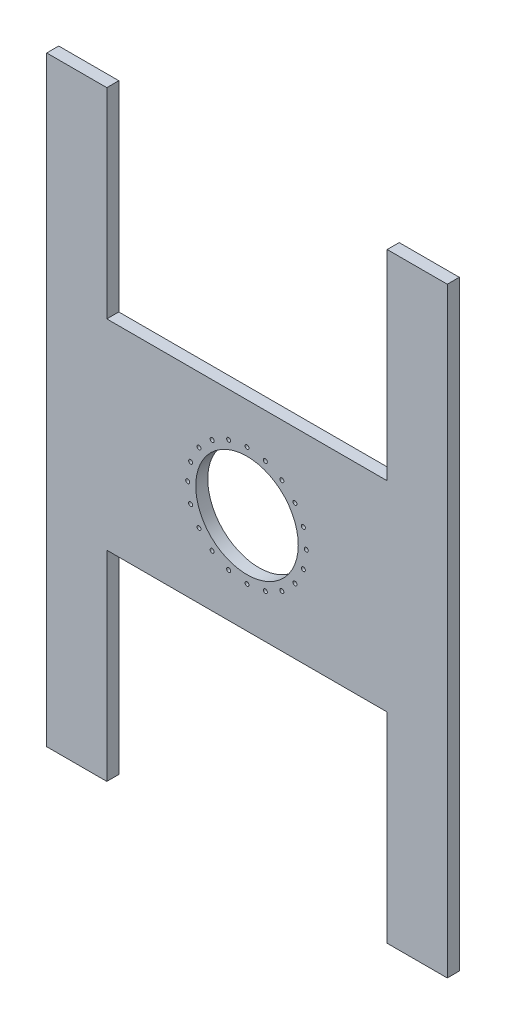
ISO-10303-21;
HEADER;
FILE_DESCRIPTION(('STEP AP214'),'2;1');
FILE_NAME('part.step','',(''),(''),'','','');
FILE_SCHEMA(('AUTOMOTIVE_DESIGN { 1 0 10303 214 1 1 1 1 }'));
ENDSEC;
DATA;
#1=APPLICATION_CONTEXT('core data for automotive mechanical design processes');
#2=APPLICATION_PROTOCOL_DEFINITION('international standard','automotive_design',2000,#1);
#3=PRODUCT_CONTEXT('',#1,'mechanical');
#4=PRODUCT('Part','Part','',(#3));
#5=PRODUCT_RELATED_PRODUCT_CATEGORY('part','',(#4));
#6=PRODUCT_DEFINITION_FORMATION('','',#4);
#7=PRODUCT_DEFINITION_CONTEXT('part definition',#1,'design');
#8=PRODUCT_DEFINITION('design','',#6,#7);
#9=PRODUCT_DEFINITION_SHAPE('','',#8);
#10=(LENGTH_UNIT() NAMED_UNIT(*) SI_UNIT(.MILLI.,.METRE.));
#11=(NAMED_UNIT(*) PLANE_ANGLE_UNIT() SI_UNIT($,.RADIAN.));
#12=(NAMED_UNIT(*) SI_UNIT($,.STERADIAN.) SOLID_ANGLE_UNIT());
#13=UNCERTAINTY_MEASURE_WITH_UNIT(LENGTH_MEASURE(1.E-05),#10,'distance_accuracy_value','');
#14=(GEOMETRIC_REPRESENTATION_CONTEXT(3) GLOBAL_UNCERTAINTY_ASSIGNED_CONTEXT((#13)) GLOBAL_UNIT_ASSIGNED_CONTEXT((#10,
#11,#12)) REPRESENTATION_CONTEXT('',''));
#15=CARTESIAN_POINT('',(0.,0.,0.));
#16=DIRECTION('',(0.,0.,1.));
#17=DIRECTION('',(1.,0.,0.));
#18=AXIS2_PLACEMENT_3D('',#15,#16,#17);
#19=CARTESIAN_POINT('',(-1000.,-1000.,60.));
#20=DIRECTION('',(1.,0.,0.));
#21=DIRECTION('',(0.,0.,-1.));
#22=AXIS2_PLACEMENT_3D('',#19,#20,#21);
#23=PLANE('',#22);
#24=DIRECTION('',(0.,-1.,0.));
#25=VECTOR('',#24,1.);
#26=CARTESIAN_POINT('',(-1000.,-1000.,0.));
#27=LINE('',#26,#25);
#28=CARTESIAN_POINT('',(-1000.,2000.,0.));
#29=VERTEX_POINT('',#28);
#30=CARTESIAN_POINT('',(-1000.,-1000.,0.));
#31=VERTEX_POINT('',#30);
#32=EDGE_CURVE('E153',#29,#31,#27,.T.);
#33=ORIENTED_EDGE('',*,*,#32,.T.);
#34=DIRECTION('',(0.,0.,-1.));
#35=VECTOR('',#34,1.);
#36=CARTESIAN_POINT('',(-1000.,-1000.,60.));
#37=LINE('',#36,#35);
#38=CARTESIAN_POINT('',(-1000.,-1000.,60.));
#39=VERTEX_POINT('',#38);
#40=EDGE_CURVE('E11',#39,#31,#37,.T.);
#41=ORIENTED_EDGE('',*,*,#40,.F.);
#42=DIRECTION('',(0.,-1.,0.));
#43=VECTOR('',#42,1.);
#44=CARTESIAN_POINT('',(-1000.,-1000.,60.));
#45=LINE('',#44,#43);
#46=CARTESIAN_POINT('',(-1000.,2000.,60.));
#47=VERTEX_POINT('',#46);
#48=EDGE_CURVE('E176',#47,#39,#45,.T.);
#49=ORIENTED_EDGE('',*,*,#48,.F.);
#50=DIRECTION('',(0.,0.,-1.));
#51=VECTOR('',#50,1.);
#52=CARTESIAN_POINT('',(-1000.,2000.,60.));
#53=LINE('',#52,#51);
#54=EDGE_CURVE('E149',#47,#29,#53,.T.);
#55=ORIENTED_EDGE('',*,*,#54,.T.);
#56=EDGE_LOOP('',(#33,#41,#49,#55));
#57=FACE_BOUND('',#56,.T.);
#58=ADVANCED_FACE('F33',(#57),#23,.F.);
#59=CARTESIAN_POINT('',(-700.,-1000.,60.));
#60=DIRECTION('',(0.,1.,0.));
#61=DIRECTION('',(0.,0.,1.));
#62=AXIS2_PLACEMENT_3D('',#59,#60,#61);
#63=PLANE('',#62);
#64=DIRECTION('',(1.,0.,0.));
#65=VECTOR('',#64,1.);
#66=CARTESIAN_POINT('',(-700.,-1000.,0.));
#67=LINE('',#66,#65);
#68=CARTESIAN_POINT('',(-700.,-1000.,0.));
#69=VERTEX_POINT('',#68);
#70=EDGE_CURVE('E156',#31,#69,#67,.T.);
#71=ORIENTED_EDGE('',*,*,#70,.T.);
#72=DIRECTION('',(0.,0.,-1.));
#73=VECTOR('',#72,1.);
#74=CARTESIAN_POINT('',(-700.,-1000.,60.));
#75=LINE('',#74,#73);
#76=CARTESIAN_POINT('',(-700.,-1000.,60.));
#77=VERTEX_POINT('',#76);
#78=EDGE_CURVE('E41',#77,#69,#75,.T.);
#79=ORIENTED_EDGE('',*,*,#78,.F.);
#80=DIRECTION('',(1.,0.,0.));
#81=VECTOR('',#80,1.);
#82=CARTESIAN_POINT('',(-700.,-1000.,60.));
#83=LINE('',#82,#81);
#84=EDGE_CURVE('E104',#39,#77,#83,.T.);
#85=ORIENTED_EDGE('',*,*,#84,.F.);
#86=ORIENTED_EDGE('',*,*,#40,.T.);
#87=EDGE_LOOP('',(#71,#79,#85,#86));
#88=FACE_BOUND('',#87,.T.);
#89=ADVANCED_FACE('F255',(#88),#63,.F.);
#90=CARTESIAN_POINT('',(-700.,-1.11022302462516E-13,60.));
#91=DIRECTION('',(-1.,0.,0.));
#92=DIRECTION('',(0.,0.,1.));
#93=AXIS2_PLACEMENT_3D('',#90,#91,#92);
#94=PLANE('',#93);
#95=DIRECTION('',(0.,1.,0.));
#96=VECTOR('',#95,1.);
#97=CARTESIAN_POINT('',(-700.,-1.11022302462516E-13,0.));
#98=LINE('',#97,#96);
#99=CARTESIAN_POINT('',(-700.,-1.11022302462516E-13,0.));
#100=VERTEX_POINT('',#99);
#101=EDGE_CURVE('E159',#69,#100,#98,.T.);
#102=ORIENTED_EDGE('',*,*,#101,.T.);
#103=DIRECTION('',(0.,0.,-1.));
#104=VECTOR('',#103,1.);
#105=CARTESIAN_POINT('',(-700.,-1.11022302462516E-13,60.));
#106=LINE('',#105,#104);
#107=CARTESIAN_POINT('',(-700.,-1.11022302462516E-13,60.));
#108=VERTEX_POINT('',#107);
#109=EDGE_CURVE('E195',#108,#100,#106,.T.);
#110=ORIENTED_EDGE('',*,*,#109,.F.);
#111=DIRECTION('',(0.,1.,0.));
#112=VECTOR('',#111,1.);
#113=CARTESIAN_POINT('',(-700.,-1.11022302462516E-13,60.));
#114=LINE('',#113,#112);
#115=EDGE_CURVE('E203',#77,#108,#114,.T.);
#116=ORIENTED_EDGE('',*,*,#115,.F.);
#117=ORIENTED_EDGE('',*,*,#78,.T.);
#118=EDGE_LOOP('',(#102,#110,#116,#117));
#119=FACE_BOUND('',#118,.T.);
#120=ADVANCED_FACE('F201',(#119),#94,.F.);
#121=CARTESIAN_POINT('',(700.,0.,60.));
#122=DIRECTION('',(0.,1.,0.));
#123=DIRECTION('',(-1.,0.,0.));
#124=AXIS2_PLACEMENT_3D('',#121,#122,#123);
#125=PLANE('',#124);
#126=DIRECTION('',(1.,0.,0.));
#127=VECTOR('',#126,1.);
#128=CARTESIAN_POINT('',(700.,0.,0.));
#129=LINE('',#128,#127);
#130=CARTESIAN_POINT('',(700.,0.,0.));
#131=VERTEX_POINT('',#130);
#132=EDGE_CURVE('E161',#100,#131,#129,.T.);
#133=ORIENTED_EDGE('',*,*,#132,.T.);
#134=DIRECTION('',(0.,0.,-1.));
#135=VECTOR('',#134,1.);
#136=CARTESIAN_POINT('',(700.,0.,60.));
#137=LINE('',#136,#135);
#138=CARTESIAN_POINT('',(700.,0.,60.));
#139=VERTEX_POINT('',#138);
#140=EDGE_CURVE('E192',#139,#131,#137,.T.);
#141=ORIENTED_EDGE('',*,*,#140,.F.);
#142=DIRECTION('',(1.,0.,0.));
#143=VECTOR('',#142,1.);
#144=CARTESIAN_POINT('',(700.,0.,60.));
#145=LINE('',#144,#143);
#146=EDGE_CURVE('E221',#108,#139,#145,.T.);
#147=ORIENTED_EDGE('',*,*,#146,.F.);
#148=ORIENTED_EDGE('',*,*,#109,.T.);
#149=EDGE_LOOP('',(#133,#141,#147,#148));
#150=FACE_BOUND('',#149,.T.);
#151=ADVANCED_FACE('F212',(#150),#125,.F.);
#152=CARTESIAN_POINT('',(700.,-1000.,60.));
#153=DIRECTION('',(1.,0.,0.));
#154=DIRECTION('',(0.,1.,0.));
#155=AXIS2_PLACEMENT_3D('',#152,#153,#154);
#156=PLANE('',#155);
#157=DIRECTION('',(0.,-1.,0.));
#158=VECTOR('',#157,1.);
#159=CARTESIAN_POINT('',(700.,-1000.,0.));
#160=LINE('',#159,#158);
#161=CARTESIAN_POINT('',(700.,-1000.,0.));
#162=VERTEX_POINT('',#161);
#163=EDGE_CURVE('E163',#131,#162,#160,.T.);
#164=ORIENTED_EDGE('',*,*,#163,.T.);
#165=DIRECTION('',(0.,0.,-1.));
#166=VECTOR('',#165,1.);
#167=CARTESIAN_POINT('',(700.,-1000.,60.));
#168=LINE('',#167,#166);
#169=CARTESIAN_POINT('',(700.,-1000.,60.));
#170=VERTEX_POINT('',#169);
#171=EDGE_CURVE('E189',#170,#162,#168,.T.);
#172=ORIENTED_EDGE('',*,*,#171,.F.);
#173=DIRECTION('',(0.,-1.,0.));
#174=VECTOR('',#173,1.);
#175=CARTESIAN_POINT('',(700.,-1000.,60.));
#176=LINE('',#175,#174);
#177=EDGE_CURVE('E218',#139,#170,#176,.T.);
#178=ORIENTED_EDGE('',*,*,#177,.F.);
#179=ORIENTED_EDGE('',*,*,#140,.T.);
#180=EDGE_LOOP('',(#164,#172,#178,#179));
#181=FACE_BOUND('',#180,.T.);
#182=ADVANCED_FACE('F216',(#181),#156,.F.);
#183=CARTESIAN_POINT('',(1000.,-1000.,60.));
#184=DIRECTION('',(0.,1.,0.));
#185=DIRECTION('',(0.,0.,1.));
#186=AXIS2_PLACEMENT_3D('',#183,#184,#185);
#187=PLANE('',#186);
#188=DIRECTION('',(1.,0.,0.));
#189=VECTOR('',#188,1.);
#190=CARTESIAN_POINT('',(1000.,-1000.,0.));
#191=LINE('',#190,#189);
#192=CARTESIAN_POINT('',(1000.,-1000.,0.));
#193=VERTEX_POINT('',#192);
#194=EDGE_CURVE('E165',#162,#193,#191,.T.);
#195=ORIENTED_EDGE('',*,*,#194,.T.);
#196=DIRECTION('',(0.,0.,-1.));
#197=VECTOR('',#196,1.);
#198=CARTESIAN_POINT('',(1000.,-1000.,60.));
#199=LINE('',#198,#197);
#200=CARTESIAN_POINT('',(1000.,-1000.,60.));
#201=VERTEX_POINT('',#200);
#202=EDGE_CURVE('E186',#201,#193,#199,.T.);
#203=ORIENTED_EDGE('',*,*,#202,.F.);
#204=DIRECTION('',(1.,0.,0.));
#205=VECTOR('',#204,1.);
#206=CARTESIAN_POINT('',(1000.,-1000.,60.));
#207=LINE('',#206,#205);
#208=EDGE_CURVE('E220',#170,#201,#207,.T.);
#209=ORIENTED_EDGE('',*,*,#208,.F.);
#210=ORIENTED_EDGE('',*,*,#171,.T.);
#211=EDGE_LOOP('',(#195,#203,#209,#210));
#212=FACE_BOUND('',#211,.T.);
#213=ADVANCED_FACE('F268',(#212),#187,.F.);
#214=CARTESIAN_POINT('',(1000.,2000.,60.));
#215=DIRECTION('',(-1.,0.,0.));
#216=DIRECTION('',(0.,-1.,0.));
#217=AXIS2_PLACEMENT_3D('',#214,#215,#216);
#218=PLANE('',#217);
#219=DIRECTION('',(0.,1.,0.));
#220=VECTOR('',#219,1.);
#221=CARTESIAN_POINT('',(1000.,2000.,0.));
#222=LINE('',#221,#220);
#223=CARTESIAN_POINT('',(1000.,2000.,0.));
#224=VERTEX_POINT('',#223);
#225=EDGE_CURVE('E167',#193,#224,#222,.T.);
#226=ORIENTED_EDGE('',*,*,#225,.T.);
#227=DIRECTION('',(0.,0.,-1.));
#228=VECTOR('',#227,1.);
#229=CARTESIAN_POINT('',(1000.,2000.,60.));
#230=LINE('',#229,#228);
#231=CARTESIAN_POINT('',(1000.,2000.,60.));
#232=VERTEX_POINT('',#231);
#233=EDGE_CURVE('E183',#232,#224,#230,.T.);
#234=ORIENTED_EDGE('',*,*,#233,.F.);
#235=DIRECTION('',(0.,1.,0.));
#236=VECTOR('',#235,1.);
#237=CARTESIAN_POINT('',(1000.,2000.,60.));
#238=LINE('',#237,#236);
#239=EDGE_CURVE('E223',#201,#232,#238,.T.);
#240=ORIENTED_EDGE('',*,*,#239,.F.);
#241=ORIENTED_EDGE('',*,*,#202,.T.);
#242=EDGE_LOOP('',(#226,#234,#240,#241));
#243=FACE_BOUND('',#242,.T.);
#244=ADVANCED_FACE('F271',(#243),#218,.F.);
#245=CARTESIAN_POINT('',(700.,2000.,60.));
#246=DIRECTION('',(0.,-1.,0.));
#247=DIRECTION('',(1.,0.,0.));
#248=AXIS2_PLACEMENT_3D('',#245,#246,#247);
#249=PLANE('',#248);
#250=DIRECTION('',(-1.,0.,0.));
#251=VECTOR('',#250,1.);
#252=CARTESIAN_POINT('',(700.,2000.,0.));
#253=LINE('',#252,#251);
#254=CARTESIAN_POINT('',(700.,2000.,0.));
#255=VERTEX_POINT('',#254);
#256=EDGE_CURVE('E169',#224,#255,#253,.T.);
#257=ORIENTED_EDGE('',*,*,#256,.T.);
#258=DIRECTION('',(0.,0.,-1.));
#259=VECTOR('',#258,1.);
#260=CARTESIAN_POINT('',(700.,2000.,60.));
#261=LINE('',#260,#259);
#262=CARTESIAN_POINT('',(700.,2000.,60.));
#263=VERTEX_POINT('',#262);
#264=EDGE_CURVE('E180',#263,#255,#261,.T.);
#265=ORIENTED_EDGE('',*,*,#264,.F.);
#266=DIRECTION('',(-1.,0.,0.));
#267=VECTOR('',#266,1.);
#268=CARTESIAN_POINT('',(700.,2000.,60.));
#269=LINE('',#268,#267);
#270=EDGE_CURVE('E229',#232,#263,#269,.T.);
#271=ORIENTED_EDGE('',*,*,#270,.F.);
#272=ORIENTED_EDGE('',*,*,#233,.T.);
#273=EDGE_LOOP('',(#257,#265,#271,#272));
#274=FACE_BOUND('',#273,.T.);
#275=ADVANCED_FACE('F235',(#274),#249,.F.);
#276=CARTESIAN_POINT('',(700.,1000.,60.));
#277=DIRECTION('',(1.,0.,0.));
#278=DIRECTION('',(0.,0.,-1.));
#279=AXIS2_PLACEMENT_3D('',#276,#277,#278);
#280=PLANE('',#279);
#281=DIRECTION('',(0.,-1.,0.));
#282=VECTOR('',#281,1.);
#283=CARTESIAN_POINT('',(700.,1000.,0.));
#284=LINE('',#283,#282);
#285=CARTESIAN_POINT('',(700.,1000.,0.));
#286=VERTEX_POINT('',#285);
#287=EDGE_CURVE('E171',#255,#286,#284,.T.);
#288=ORIENTED_EDGE('',*,*,#287,.T.);
#289=DIRECTION('',(0.,0.,-1.));
#290=VECTOR('',#289,1.);
#291=CARTESIAN_POINT('',(700.,1000.,60.));
#292=LINE('',#291,#290);
#293=CARTESIAN_POINT('',(700.,1000.,60.));
#294=VERTEX_POINT('',#293);
#295=EDGE_CURVE('E144',#294,#286,#292,.T.);
#296=ORIENTED_EDGE('',*,*,#295,.F.);
#297=DIRECTION('',(0.,-1.,0.));
#298=VECTOR('',#297,1.);
#299=CARTESIAN_POINT('',(700.,1000.,60.));
#300=LINE('',#299,#298);
#301=EDGE_CURVE('E135',#263,#294,#300,.T.);
#302=ORIENTED_EDGE('',*,*,#301,.F.);
#303=ORIENTED_EDGE('',*,*,#264,.T.);
#304=EDGE_LOOP('',(#288,#296,#302,#303));
#305=FACE_BOUND('',#304,.T.);
#306=ADVANCED_FACE('F239',(#305),#280,.F.);
#307=CARTESIAN_POINT('',(-700.,1000.,60.));
#308=DIRECTION('',(0.,-1.,0.));
#309=DIRECTION('',(1.,0.,0.));
#310=AXIS2_PLACEMENT_3D('',#307,#308,#309);
#311=PLANE('',#310);
#312=DIRECTION('',(-1.,0.,0.));
#313=VECTOR('',#312,1.);
#314=CARTESIAN_POINT('',(-700.,1000.,0.));
#315=LINE('',#314,#313);
#316=CARTESIAN_POINT('',(-700.,1000.,0.));
#317=VERTEX_POINT('',#316);
#318=EDGE_CURVE('E143',#286,#317,#315,.T.);
#319=ORIENTED_EDGE('',*,*,#318,.T.);
#320=DIRECTION('',(0.,0.,-1.));
#321=VECTOR('',#320,1.);
#322=CARTESIAN_POINT('',(-700.,1000.,60.));
#323=LINE('',#322,#321);
#324=CARTESIAN_POINT('',(-700.,1000.,60.));
#325=VERTEX_POINT('',#324);
#326=EDGE_CURVE('E140',#325,#317,#323,.T.);
#327=ORIENTED_EDGE('',*,*,#326,.F.);
#328=DIRECTION('',(-1.,0.,0.));
#329=VECTOR('',#328,1.);
#330=CARTESIAN_POINT('',(-700.,1000.,60.));
#331=LINE('',#330,#329);
#332=EDGE_CURVE('E129',#294,#325,#331,.T.);
#333=ORIENTED_EDGE('',*,*,#332,.F.);
#334=ORIENTED_EDGE('',*,*,#295,.T.);
#335=EDGE_LOOP('',(#319,#327,#333,#334));
#336=FACE_BOUND('',#335,.T.);
#337=ADVANCED_FACE('F141',(#336),#311,.F.);
#338=CARTESIAN_POINT('',(-700.,2000.,60.));
#339=DIRECTION('',(-1.,0.,0.));
#340=DIRECTION('',(0.,-1.,0.));
#341=AXIS2_PLACEMENT_3D('',#338,#339,#340);
#342=PLANE('',#341);
#343=DIRECTION('',(0.,1.,0.));
#344=VECTOR('',#343,1.);
#345=CARTESIAN_POINT('',(-700.,2000.,0.));
#346=LINE('',#345,#344);
#347=CARTESIAN_POINT('',(-700.,2000.,0.));
#348=VERTEX_POINT('',#347);
#349=EDGE_CURVE('E90',#317,#348,#346,.T.);
#350=ORIENTED_EDGE('',*,*,#349,.T.);
#351=DIRECTION('',(0.,0.,-1.));
#352=VECTOR('',#351,1.);
#353=CARTESIAN_POINT('',(-700.,2000.,60.));
#354=LINE('',#353,#352);
#355=CARTESIAN_POINT('',(-700.,2000.,60.));
#356=VERTEX_POINT('',#355);
#357=EDGE_CURVE('E145',#356,#348,#354,.T.);
#358=ORIENTED_EDGE('',*,*,#357,.F.);
#359=DIRECTION('',(0.,1.,0.));
#360=VECTOR('',#359,1.);
#361=CARTESIAN_POINT('',(-700.,2000.,60.));
#362=LINE('',#361,#360);
#363=EDGE_CURVE('E133',#325,#356,#362,.T.);
#364=ORIENTED_EDGE('',*,*,#363,.F.);
#365=ORIENTED_EDGE('',*,*,#326,.T.);
#366=EDGE_LOOP('',(#350,#358,#364,#365));
#367=FACE_BOUND('',#366,.T.);
#368=ADVANCED_FACE('F147',(#367),#342,.F.);
#369=CARTESIAN_POINT('',(-1000.,2000.,60.));
#370=DIRECTION('',(0.,-1.,0.));
#371=DIRECTION('',(0.,0.,-1.));
#372=AXIS2_PLACEMENT_3D('',#369,#370,#371);
#373=PLANE('',#372);
#374=DIRECTION('',(-1.,0.,0.));
#375=VECTOR('',#374,1.);
#376=CARTESIAN_POINT('',(-1000.,2000.,0.));
#377=LINE('',#376,#375);
#378=EDGE_CURVE('E96',#348,#29,#377,.T.);
#379=ORIENTED_EDGE('',*,*,#378,.T.);
#380=ORIENTED_EDGE('',*,*,#54,.F.);
#381=DIRECTION('',(-1.,0.,0.));
#382=VECTOR('',#381,1.);
#383=CARTESIAN_POINT('',(-1000.,2000.,60.));
#384=LINE('',#383,#382);
#385=EDGE_CURVE('E49',#356,#47,#384,.T.);
#386=ORIENTED_EDGE('',*,*,#385,.F.);
#387=ORIENTED_EDGE('',*,*,#357,.T.);
#388=EDGE_LOOP('',(#379,#380,#386,#387));
#389=FACE_BOUND('',#388,.T.);
#390=ADVANCED_FACE('F243',(#389),#373,.F.);
#391=CARTESIAN_POINT('',(0.,0.,60.));
#392=DIRECTION('',(0.,0.,-1.));
#393=DIRECTION('',(-1.,0.,0.));
#394=AXIS2_PLACEMENT_3D('',#391,#392,#393);
#395=PLANE('',#394);
#396=CARTESIAN_POINT('',(173.984434678572,739.469030334984,60.));
#397=DIRECTION('',(0.,0.,1.));
#398=DIRECTION('',(0.809016994374947,-0.587785252292474,0.));
#399=AXIS2_PLACEMENT_3D('',#396,#397,#398);
#400=CIRCLE('',#399,10.);
#401=CARTESIAN_POINT('',(182.074604622322,733.59117781206,60.));
#402=VERTEX_POINT('',#401);
#403=EDGE_CURVE('E524',#402,#402,#400,.T.);
#404=ORIENTED_EDGE('',*,*,#403,.F.);
#405=EDGE_LOOP('',(#404));
#406=FACE_BOUND('',#405,.T.);
#407=CARTESIAN_POINT('',(239.469030334985,673.984434678571,60.));
#408=DIRECTION('',(0.,0.,1.));
#409=DIRECTION('',(0.587785252292471,-0.809016994374949,0.));
#410=AXIS2_PLACEMENT_3D('',#407,#408,#409);
#411=CIRCLE('',#410,10.);
#412=CARTESIAN_POINT('',(245.34688285791,665.894264734822,60.));
#413=VERTEX_POINT('',#412);
#414=EDGE_CURVE('E528',#413,#413,#411,.T.);
#415=ORIENTED_EDGE('',*,*,#414,.F.);
#416=EDGE_LOOP('',(#415));
#417=FACE_BOUND('',#416,.T.);
#418=CARTESIAN_POINT('',(281.512728823366,591.469030334984,60.));
#419=DIRECTION('',(0.,0.,1.));
#420=DIRECTION('',(0.309016994374945,-0.951056516295155,0.));
#421=AXIS2_PLACEMENT_3D('',#418,#419,#420);
#422=CIRCLE('',#421,10.);
#423=CARTESIAN_POINT('',(284.602898767115,581.958465172032,60.));
#424=VERTEX_POINT('',#423);
#425=EDGE_CURVE('E539',#424,#424,#422,.T.);
#426=ORIENTED_EDGE('',*,*,#425,.F.);
#427=EDGE_LOOP('',(#426));
#428=FACE_BOUND('',#427,.T.);
#429=CARTESIAN_POINT('',(296.,499.999999999999,60.));
#430=DIRECTION('',(0.,0.,1.));
#431=DIRECTION('',(0.,-1.,0.));
#432=AXIS2_PLACEMENT_3D('',#429,#430,#431);
#433=CIRCLE('',#432,10.);
#434=CARTESIAN_POINT('',(296.,489.999999999999,60.));
#435=VERTEX_POINT('',#434);
#436=EDGE_CURVE('E545',#435,#435,#433,.T.);
#437=ORIENTED_EDGE('',*,*,#436,.F.);
#438=EDGE_LOOP('',(#437));
#439=FACE_BOUND('',#438,.T.);
#440=CARTESIAN_POINT('',(281.512728823365,408.530969665014,60.));
#441=DIRECTION('',(0.,0.,1.));
#442=DIRECTION('',(-0.309016994374952,-0.951056516295152,0.));
#443=AXIS2_PLACEMENT_3D('',#440,#441,#442);
#444=CIRCLE('',#443,10.);
#445=CARTESIAN_POINT('',(278.422558879616,399.020404502063,60.));
#446=VERTEX_POINT('',#445);
#447=EDGE_CURVE('E551',#446,#446,#444,.T.);
#448=ORIENTED_EDGE('',*,*,#447,.F.);
#449=EDGE_LOOP('',(#448));
#450=FACE_BOUND('',#449,.T.);
#451=CARTESIAN_POINT('',(239.469030334984,326.015565321427,60.));
#452=DIRECTION('',(0.,0.,1.));
#453=DIRECTION('',(-0.587785252292477,-0.809016994374945,0.));
#454=AXIS2_PLACEMENT_3D('',#451,#452,#453);
#455=CIRCLE('',#454,10.);
#456=CARTESIAN_POINT('',(233.591177812059,317.925395377677,60.));
#457=VERTEX_POINT('',#456);
#458=EDGE_CURVE('E557',#457,#457,#455,.T.);
#459=ORIENTED_EDGE('',*,*,#458,.F.);
#460=EDGE_LOOP('',(#459));
#461=FACE_BOUND('',#460,.T.);
#462=CARTESIAN_POINT('',(173.984434678571,260.530969665015,60.));
#463=DIRECTION('',(0.,0.,1.));
#464=DIRECTION('',(-0.809016994374951,-0.587785252292469,0.));
#465=AXIS2_PLACEMENT_3D('',#462,#463,#464);
#466=CIRCLE('',#465,10.);
#467=CARTESIAN_POINT('',(165.894264734821,254.65311714209,60.));
#468=VERTEX_POINT('',#467);
#469=EDGE_CURVE('E563',#468,#468,#466,.T.);
#470=ORIENTED_EDGE('',*,*,#469,.F.);
#471=EDGE_LOOP('',(#470));
#472=FACE_BOUND('',#471,.T.);
#473=CARTESIAN_POINT('',(91.4690303349826,218.487271176634,60.));
#474=DIRECTION('',(0.,0.,1.));
#475=DIRECTION('',(-0.951056516295156,-0.309016994374941,0.));
#476=AXIS2_PLACEMENT_3D('',#473,#474,#475);
#477=CIRCLE('',#476,10.);
#478=CARTESIAN_POINT('',(81.958465172031,215.397101232884,60.));
#479=VERTEX_POINT('',#478);
#480=EDGE_CURVE('E569',#479,#479,#477,.T.);
#481=ORIENTED_EDGE('',*,*,#480,.F.);
#482=EDGE_LOOP('',(#481));
#483=FACE_BOUND('',#482,.T.);
#484=CARTESIAN_POINT('',(0.,204.,60.));
#485=DIRECTION('',(0.,0.,1.));
#486=DIRECTION('',(-1.,0.,0.));
#487=AXIS2_PLACEMENT_3D('',#484,#485,#486);
#488=CIRCLE('',#487,10.);
#489=CARTESIAN_POINT('',(-10.,204.,60.));
#490=VERTEX_POINT('',#489);
#491=EDGE_CURVE('E575',#490,#490,#488,.T.);
#492=ORIENTED_EDGE('',*,*,#491,.F.);
#493=EDGE_LOOP('',(#492));
#494=FACE_BOUND('',#493,.T.);
#495=CARTESIAN_POINT('',(-91.4690303349867,218.487271176635,60.));
#496=DIRECTION('',(0.,0.,1.));
#497=DIRECTION('',(-0.951056516295151,0.309016994374955,0.));
#498=AXIS2_PLACEMENT_3D('',#495,#496,#497);
#499=CIRCLE('',#498,10.);
#500=CARTESIAN_POINT('',(-100.979595497938,221.577441120385,60.));
#501=VERTEX_POINT('',#500);
#502=EDGE_CURVE('E581',#501,#501,#499,.T.);
#503=ORIENTED_EDGE('',*,*,#502,.F.);
#504=EDGE_LOOP('',(#503));
#505=FACE_BOUND('',#504,.T.);
#506=CARTESIAN_POINT('',(-173.984434678574,260.530969665017,60.));
#507=DIRECTION('',(0.,0.,1.));
#508=DIRECTION('',(-0.809016994374942,0.58778525229248,0.));
#509=AXIS2_PLACEMENT_3D('',#506,#507,#508);
#510=CIRCLE('',#509,10.);
#511=CARTESIAN_POINT('',(-182.074604622324,266.408822187942,60.));
#512=VERTEX_POINT('',#511);
#513=EDGE_CURVE('E587',#512,#512,#510,.T.);
#514=ORIENTED_EDGE('',*,*,#513,.F.);
#515=EDGE_LOOP('',(#514));
#516=FACE_BOUND('',#515,.T.);
#517=CARTESIAN_POINT('',(-239.469030334986,326.01556532143,60.));
#518=DIRECTION('',(0.,0.,1.));
#519=DIRECTION('',(-0.587785252292465,0.809016994374953,0.));
#520=AXIS2_PLACEMENT_3D('',#517,#518,#519);
#521=CIRCLE('',#520,10.);
#522=CARTESIAN_POINT('',(-245.346882857911,334.10573526518,60.));
#523=VERTEX_POINT('',#522);
#524=EDGE_CURVE('E593',#523,#523,#521,.T.);
#525=ORIENTED_EDGE('',*,*,#524,.F.);
#526=EDGE_LOOP('',(#525));
#527=FACE_BOUND('',#526,.T.);
#528=CARTESIAN_POINT('',(-281.512728823366,408.530969665018,60.));
#529=DIRECTION('',(0.,0.,1.));
#530=DIRECTION('',(-0.309016994374938,0.951056516295157,0.));
#531=AXIS2_PLACEMENT_3D('',#528,#529,#530);
#532=CIRCLE('',#531,10.);
#533=CARTESIAN_POINT('',(-284.602898767116,418.04153482797,60.));
#534=VERTEX_POINT('',#533);
#535=EDGE_CURVE('E599',#534,#534,#532,.T.);
#536=ORIENTED_EDGE('',*,*,#535,.F.);
#537=EDGE_LOOP('',(#536));
#538=FACE_BOUND('',#537,.T.);
#539=CARTESIAN_POINT('',(-296.,500.000000000003,60.));
#540=DIRECTION('',(0.,0.,1.));
#541=DIRECTION('',(0.,1.,0.));
#542=AXIS2_PLACEMENT_3D('',#539,#540,#541);
#543=CIRCLE('',#542,10.);
#544=CARTESIAN_POINT('',(-296.,510.000000000003,60.));
#545=VERTEX_POINT('',#544);
#546=EDGE_CURVE('E605',#545,#545,#543,.T.);
#547=ORIENTED_EDGE('',*,*,#546,.F.);
#548=EDGE_LOOP('',(#547));
#549=FACE_BOUND('',#548,.T.);
#550=CARTESIAN_POINT('',(-281.512728823364,591.469030334988,60.));
#551=DIRECTION('',(0.,0.,1.));
#552=DIRECTION('',(0.309016994374958,0.95105651629515,0.));
#553=AXIS2_PLACEMENT_3D('',#550,#551,#552);
#554=CIRCLE('',#553,10.);
#555=CARTESIAN_POINT('',(-278.422558879615,600.979595497939,60.));
#556=VERTEX_POINT('',#555);
#557=EDGE_CURVE('E611',#556,#556,#554,.T.);
#558=ORIENTED_EDGE('',*,*,#557,.F.);
#559=EDGE_LOOP('',(#558));
#560=FACE_BOUND('',#559,.T.);
#561=CARTESIAN_POINT('',(-239.469030334982,673.984434678575,60.));
#562=DIRECTION('',(0.,0.,1.));
#563=DIRECTION('',(0.587785252292483,0.80901699437494,0.));
#564=AXIS2_PLACEMENT_3D('',#561,#562,#563);
#565=CIRCLE('',#564,10.);
#566=CARTESIAN_POINT('',(-233.591177812057,682.074604622325,60.));
#567=VERTEX_POINT('',#566);
#568=EDGE_CURVE('E617',#567,#567,#565,.T.);
#569=ORIENTED_EDGE('',*,*,#568,.F.);
#570=EDGE_LOOP('',(#569));
#571=FACE_BOUND('',#570,.T.);
#572=CARTESIAN_POINT('',(-173.984434678569,739.469030334987,60.));
#573=DIRECTION('',(0.,0.,1.));
#574=DIRECTION('',(0.809016994374955,0.587785252292462,0.));
#575=AXIS2_PLACEMENT_3D('',#572,#573,#574);
#576=CIRCLE('',#575,10.);
#577=CARTESIAN_POINT('',(-165.894264734819,745.346882857911,60.));
#578=VERTEX_POINT('',#577);
#579=EDGE_CURVE('E623',#578,#578,#576,.T.);
#580=ORIENTED_EDGE('',*,*,#579,.F.);
#581=EDGE_LOOP('',(#580));
#582=FACE_BOUND('',#581,.T.);
#583=CARTESIAN_POINT('',(-91.4690303349808,781.512728823367,60.));
#584=DIRECTION('',(0.,0.,1.));
#585=DIRECTION('',(0.951056516295158,0.309016994374935,0.));
#586=AXIS2_PLACEMENT_3D('',#583,#584,#585);
#587=CIRCLE('',#586,10.);
#588=CARTESIAN_POINT('',(-81.9584651720292,784.602898767116,60.));
#589=VERTEX_POINT('',#588);
#590=EDGE_CURVE('E663',#589,#589,#587,.T.);
#591=ORIENTED_EDGE('',*,*,#590,.F.);
#592=EDGE_LOOP('',(#591));
#593=FACE_BOUND('',#592,.T.);
#594=CARTESIAN_POINT('',(91.4690303349847,781.512728823365,60.));
#595=DIRECTION('',(0.,0.,1.));
#596=DIRECTION('',(0.951056516295154,-0.309016994374948,0.));
#597=AXIS2_PLACEMENT_3D('',#594,#595,#596);
#598=CIRCLE('',#597,10.);
#599=CARTESIAN_POINT('',(100.979595497936,778.422558879616,60.));
#600=VERTEX_POINT('',#599);
#601=EDGE_CURVE('E624',#600,#600,#598,.T.);
#602=ORIENTED_EDGE('',*,*,#601,.F.);
#603=EDGE_LOOP('',(#602));
#604=FACE_BOUND('',#603,.T.);
#605=CARTESIAN_POINT('',(0.,796.,60.));
#606=DIRECTION('',(0.,0.,1.));
#607=DIRECTION('',(1.,0.,0.));
#608=AXIS2_PLACEMENT_3D('',#605,#606,#607);
#609=CIRCLE('',#608,10.);
#610=CARTESIAN_POINT('',(10.,796.,60.));
#611=VERTEX_POINT('',#610);
#612=EDGE_CURVE('E630',#611,#611,#609,.T.);
#613=ORIENTED_EDGE('',*,*,#612,.F.);
#614=EDGE_LOOP('',(#613));
#615=FACE_BOUND('',#614,.T.);
#616=CARTESIAN_POINT('',(0.,500.,60.));
#617=DIRECTION('',(0.,0.,1.));
#618=DIRECTION('',(1.,0.,0.));
#619=AXIS2_PLACEMENT_3D('',#616,#617,#618);
#620=CIRCLE('',#619,256.);
#621=CARTESIAN_POINT('',(256.,500.,60.));
#622=VERTEX_POINT('',#621);
#623=EDGE_CURVE('E633',#622,#622,#620,.T.);
#624=ORIENTED_EDGE('',*,*,#623,.F.);
#625=EDGE_LOOP('',(#624));
#626=FACE_BOUND('',#625,.T.);
#627=ORIENTED_EDGE('',*,*,#48,.T.);
#628=ORIENTED_EDGE('',*,*,#84,.T.);
#629=ORIENTED_EDGE('',*,*,#115,.T.);
#630=ORIENTED_EDGE('',*,*,#146,.T.);
#631=ORIENTED_EDGE('',*,*,#177,.T.);
#632=ORIENTED_EDGE('',*,*,#208,.T.);
#633=ORIENTED_EDGE('',*,*,#239,.T.);
#634=ORIENTED_EDGE('',*,*,#270,.T.);
#635=ORIENTED_EDGE('',*,*,#301,.T.);
#636=ORIENTED_EDGE('',*,*,#332,.T.);
#637=ORIENTED_EDGE('',*,*,#363,.T.);
#638=ORIENTED_EDGE('',*,*,#385,.T.);
#639=EDGE_LOOP('',(#627,#628,#629,#630,#631,#632,#633,#634,#635,#636,#637,#638));
#640=FACE_BOUND('',#639,.T.);
#641=ADVANCED_FACE('F131',(#406,#417,#428,#439,#450,#461,#472,#483,#494,#505,#516,#527,#538,
#549,#560,#571,#582,#593,#604,#615,#626,#640),#395,.F.);
#642=CARTESIAN_POINT('',(0.,0.,0.));
#643=DIRECTION('',(0.,0.,-1.));
#644=DIRECTION('',(-1.,0.,0.));
#645=AXIS2_PLACEMENT_3D('',#642,#643,#644);
#646=PLANE('',#645);
#647=CARTESIAN_POINT('',(173.984434678572,739.469030334984,0.));
#648=DIRECTION('',(0.,0.,1.));
#649=DIRECTION('',(0.809016994374947,-0.587785252292474,0.));
#650=AXIS2_PLACEMENT_3D('',#647,#648,#649);
#651=CIRCLE('',#650,10.);
#652=CARTESIAN_POINT('',(182.074604622322,733.59117781206,0.));
#653=VERTEX_POINT('',#652);
#654=EDGE_CURVE('E527',#653,#653,#651,.T.);
#655=ORIENTED_EDGE('',*,*,#654,.T.);
#656=EDGE_LOOP('',(#655));
#657=FACE_BOUND('',#656,.T.);
#658=CARTESIAN_POINT('',(239.469030334985,673.984434678571,0.));
#659=DIRECTION('',(0.,0.,1.));
#660=DIRECTION('',(0.587785252292471,-0.809016994374949,0.));
#661=AXIS2_PLACEMENT_3D('',#658,#659,#660);
#662=CIRCLE('',#661,10.);
#663=CARTESIAN_POINT('',(245.34688285791,665.894264734822,0.));
#664=VERTEX_POINT('',#663);
#665=EDGE_CURVE('E533',#664,#664,#662,.T.);
#666=ORIENTED_EDGE('',*,*,#665,.T.);
#667=EDGE_LOOP('',(#666));
#668=FACE_BOUND('',#667,.T.);
#669=CARTESIAN_POINT('',(281.512728823366,591.469030334984,0.));
#670=DIRECTION('',(0.,0.,1.));
#671=DIRECTION('',(0.309016994374945,-0.951056516295155,0.));
#672=AXIS2_PLACEMENT_3D('',#669,#670,#671);
#673=CIRCLE('',#672,10.);
#674=CARTESIAN_POINT('',(284.602898767115,581.958465172032,0.));
#675=VERTEX_POINT('',#674);
#676=EDGE_CURVE('E542',#675,#675,#673,.T.);
#677=ORIENTED_EDGE('',*,*,#676,.T.);
#678=EDGE_LOOP('',(#677));
#679=FACE_BOUND('',#678,.T.);
#680=CARTESIAN_POINT('',(296.,499.999999999999,0.));
#681=DIRECTION('',(0.,0.,1.));
#682=DIRECTION('',(0.,-1.,0.));
#683=AXIS2_PLACEMENT_3D('',#680,#681,#682);
#684=CIRCLE('',#683,10.);
#685=CARTESIAN_POINT('',(296.,489.999999999999,0.));
#686=VERTEX_POINT('',#685);
#687=EDGE_CURVE('E548',#686,#686,#684,.T.);
#688=ORIENTED_EDGE('',*,*,#687,.T.);
#689=EDGE_LOOP('',(#688));
#690=FACE_BOUND('',#689,.T.);
#691=CARTESIAN_POINT('',(281.512728823365,408.530969665014,0.));
#692=DIRECTION('',(0.,0.,1.));
#693=DIRECTION('',(-0.309016994374952,-0.951056516295152,0.));
#694=AXIS2_PLACEMENT_3D('',#691,#692,#693);
#695=CIRCLE('',#694,10.);
#696=CARTESIAN_POINT('',(278.422558879616,399.020404502063,0.));
#697=VERTEX_POINT('',#696);
#698=EDGE_CURVE('E554',#697,#697,#695,.T.);
#699=ORIENTED_EDGE('',*,*,#698,.T.);
#700=EDGE_LOOP('',(#699));
#701=FACE_BOUND('',#700,.T.);
#702=CARTESIAN_POINT('',(239.469030334984,326.015565321427,0.));
#703=DIRECTION('',(0.,0.,1.));
#704=DIRECTION('',(-0.587785252292477,-0.809016994374945,0.));
#705=AXIS2_PLACEMENT_3D('',#702,#703,#704);
#706=CIRCLE('',#705,10.);
#707=CARTESIAN_POINT('',(233.591177812059,317.925395377677,0.));
#708=VERTEX_POINT('',#707);
#709=EDGE_CURVE('E560',#708,#708,#706,.T.);
#710=ORIENTED_EDGE('',*,*,#709,.T.);
#711=EDGE_LOOP('',(#710));
#712=FACE_BOUND('',#711,.T.);
#713=CARTESIAN_POINT('',(173.984434678571,260.530969665015,0.));
#714=DIRECTION('',(0.,0.,1.));
#715=DIRECTION('',(-0.809016994374951,-0.587785252292469,0.));
#716=AXIS2_PLACEMENT_3D('',#713,#714,#715);
#717=CIRCLE('',#716,10.);
#718=CARTESIAN_POINT('',(165.894264734821,254.65311714209,0.));
#719=VERTEX_POINT('',#718);
#720=EDGE_CURVE('E566',#719,#719,#717,.T.);
#721=ORIENTED_EDGE('',*,*,#720,.T.);
#722=EDGE_LOOP('',(#721));
#723=FACE_BOUND('',#722,.T.);
#724=CARTESIAN_POINT('',(91.4690303349826,218.487271176634,0.));
#725=DIRECTION('',(0.,0.,1.));
#726=DIRECTION('',(-0.951056516295156,-0.309016994374941,0.));
#727=AXIS2_PLACEMENT_3D('',#724,#725,#726);
#728=CIRCLE('',#727,10.);
#729=CARTESIAN_POINT('',(81.958465172031,215.397101232884,0.));
#730=VERTEX_POINT('',#729);
#731=EDGE_CURVE('E572',#730,#730,#728,.T.);
#732=ORIENTED_EDGE('',*,*,#731,.T.);
#733=EDGE_LOOP('',(#732));
#734=FACE_BOUND('',#733,.T.);
#735=CARTESIAN_POINT('',(0.,204.,0.));
#736=DIRECTION('',(0.,0.,1.));
#737=DIRECTION('',(-1.,0.,0.));
#738=AXIS2_PLACEMENT_3D('',#735,#736,#737);
#739=CIRCLE('',#738,10.);
#740=CARTESIAN_POINT('',(-10.,204.,0.));
#741=VERTEX_POINT('',#740);
#742=EDGE_CURVE('E578',#741,#741,#739,.T.);
#743=ORIENTED_EDGE('',*,*,#742,.T.);
#744=EDGE_LOOP('',(#743));
#745=FACE_BOUND('',#744,.T.);
#746=CARTESIAN_POINT('',(-91.4690303349867,218.487271176635,0.));
#747=DIRECTION('',(0.,0.,1.));
#748=DIRECTION('',(-0.951056516295151,0.309016994374955,0.));
#749=AXIS2_PLACEMENT_3D('',#746,#747,#748);
#750=CIRCLE('',#749,10.);
#751=CARTESIAN_POINT('',(-100.979595497938,221.577441120385,0.));
#752=VERTEX_POINT('',#751);
#753=EDGE_CURVE('E584',#752,#752,#750,.T.);
#754=ORIENTED_EDGE('',*,*,#753,.T.);
#755=EDGE_LOOP('',(#754));
#756=FACE_BOUND('',#755,.T.);
#757=CARTESIAN_POINT('',(-173.984434678574,260.530969665017,0.));
#758=DIRECTION('',(0.,0.,1.));
#759=DIRECTION('',(-0.809016994374942,0.58778525229248,0.));
#760=AXIS2_PLACEMENT_3D('',#757,#758,#759);
#761=CIRCLE('',#760,10.);
#762=CARTESIAN_POINT('',(-182.074604622324,266.408822187942,0.));
#763=VERTEX_POINT('',#762);
#764=EDGE_CURVE('E590',#763,#763,#761,.T.);
#765=ORIENTED_EDGE('',*,*,#764,.T.);
#766=EDGE_LOOP('',(#765));
#767=FACE_BOUND('',#766,.T.);
#768=CARTESIAN_POINT('',(-239.469030334986,326.01556532143,0.));
#769=DIRECTION('',(0.,0.,1.));
#770=DIRECTION('',(-0.587785252292465,0.809016994374953,0.));
#771=AXIS2_PLACEMENT_3D('',#768,#769,#770);
#772=CIRCLE('',#771,10.);
#773=CARTESIAN_POINT('',(-245.346882857911,334.10573526518,0.));
#774=VERTEX_POINT('',#773);
#775=EDGE_CURVE('E596',#774,#774,#772,.T.);
#776=ORIENTED_EDGE('',*,*,#775,.T.);
#777=EDGE_LOOP('',(#776));
#778=FACE_BOUND('',#777,.T.);
#779=CARTESIAN_POINT('',(-281.512728823366,408.530969665018,0.));
#780=DIRECTION('',(0.,0.,1.));
#781=DIRECTION('',(-0.309016994374938,0.951056516295157,0.));
#782=AXIS2_PLACEMENT_3D('',#779,#780,#781);
#783=CIRCLE('',#782,10.);
#784=CARTESIAN_POINT('',(-284.602898767116,418.04153482797,0.));
#785=VERTEX_POINT('',#784);
#786=EDGE_CURVE('E602',#785,#785,#783,.T.);
#787=ORIENTED_EDGE('',*,*,#786,.T.);
#788=EDGE_LOOP('',(#787));
#789=FACE_BOUND('',#788,.T.);
#790=CARTESIAN_POINT('',(-296.,500.000000000003,0.));
#791=DIRECTION('',(0.,0.,1.));
#792=DIRECTION('',(0.,1.,0.));
#793=AXIS2_PLACEMENT_3D('',#790,#791,#792);
#794=CIRCLE('',#793,10.);
#795=CARTESIAN_POINT('',(-296.,510.000000000003,0.));
#796=VERTEX_POINT('',#795);
#797=EDGE_CURVE('E608',#796,#796,#794,.T.);
#798=ORIENTED_EDGE('',*,*,#797,.T.);
#799=EDGE_LOOP('',(#798));
#800=FACE_BOUND('',#799,.T.);
#801=CARTESIAN_POINT('',(-281.512728823364,591.469030334988,0.));
#802=DIRECTION('',(0.,0.,1.));
#803=DIRECTION('',(0.309016994374958,0.95105651629515,0.));
#804=AXIS2_PLACEMENT_3D('',#801,#802,#803);
#805=CIRCLE('',#804,10.);
#806=CARTESIAN_POINT('',(-278.422558879615,600.979595497939,0.));
#807=VERTEX_POINT('',#806);
#808=EDGE_CURVE('E614',#807,#807,#805,.T.);
#809=ORIENTED_EDGE('',*,*,#808,.T.);
#810=EDGE_LOOP('',(#809));
#811=FACE_BOUND('',#810,.T.);
#812=CARTESIAN_POINT('',(-239.469030334982,673.984434678575,0.));
#813=DIRECTION('',(0.,0.,1.));
#814=DIRECTION('',(0.587785252292483,0.80901699437494,0.));
#815=AXIS2_PLACEMENT_3D('',#812,#813,#814);
#816=CIRCLE('',#815,10.);
#817=CARTESIAN_POINT('',(-233.591177812057,682.074604622325,0.));
#818=VERTEX_POINT('',#817);
#819=EDGE_CURVE('E620',#818,#818,#816,.T.);
#820=ORIENTED_EDGE('',*,*,#819,.T.);
#821=EDGE_LOOP('',(#820));
#822=FACE_BOUND('',#821,.T.);
#823=CARTESIAN_POINT('',(-173.984434678569,739.469030334987,0.));
#824=DIRECTION('',(0.,0.,1.));
#825=DIRECTION('',(0.809016994374955,0.587785252292462,0.));
#826=AXIS2_PLACEMENT_3D('',#823,#824,#825);
#827=CIRCLE('',#826,10.);
#828=CARTESIAN_POINT('',(-165.894264734819,745.346882857911,0.));
#829=VERTEX_POINT('',#828);
#830=EDGE_CURVE('E659',#829,#829,#827,.T.);
#831=ORIENTED_EDGE('',*,*,#830,.T.);
#832=EDGE_LOOP('',(#831));
#833=FACE_BOUND('',#832,.T.);
#834=CARTESIAN_POINT('',(-91.4690303349808,781.512728823367,0.));
#835=DIRECTION('',(0.,0.,1.));
#836=DIRECTION('',(0.951056516295158,0.309016994374935,0.));
#837=AXIS2_PLACEMENT_3D('',#834,#835,#836);
#838=CIRCLE('',#837,10.);
#839=CARTESIAN_POINT('',(-81.9584651720292,784.602898767116,0.));
#840=VERTEX_POINT('',#839);
#841=EDGE_CURVE('E667',#840,#840,#838,.T.);
#842=ORIENTED_EDGE('',*,*,#841,.T.);
#843=EDGE_LOOP('',(#842));
#844=FACE_BOUND('',#843,.T.);
#845=CARTESIAN_POINT('',(91.4690303349847,781.512728823365,0.));
#846=DIRECTION('',(0.,0.,1.));
#847=DIRECTION('',(0.951056516295154,-0.309016994374948,0.));
#848=AXIS2_PLACEMENT_3D('',#845,#846,#847);
#849=CIRCLE('',#848,10.);
#850=CARTESIAN_POINT('',(100.979595497936,778.422558879616,0.));
#851=VERTEX_POINT('',#850);
#852=EDGE_CURVE('E530',#851,#851,#849,.T.);
#853=ORIENTED_EDGE('',*,*,#852,.T.);
#854=EDGE_LOOP('',(#853));
#855=FACE_BOUND('',#854,.T.);
#856=CARTESIAN_POINT('',(0.,796.,0.));
#857=DIRECTION('',(0.,0.,1.));
#858=DIRECTION('',(1.,0.,0.));
#859=AXIS2_PLACEMENT_3D('',#856,#857,#858);
#860=CIRCLE('',#859,10.);
#861=CARTESIAN_POINT('',(10.,796.,0.));
#862=VERTEX_POINT('',#861);
#863=EDGE_CURVE('E627',#862,#862,#860,.T.);
#864=ORIENTED_EDGE('',*,*,#863,.T.);
#865=EDGE_LOOP('',(#864));
#866=FACE_BOUND('',#865,.T.);
#867=CARTESIAN_POINT('',(0.,500.,0.));
#868=DIRECTION('',(0.,0.,1.));
#869=DIRECTION('',(1.,0.,0.));
#870=AXIS2_PLACEMENT_3D('',#867,#868,#869);
#871=CIRCLE('',#870,256.);
#872=CARTESIAN_POINT('',(256.,500.,0.));
#873=VERTEX_POINT('',#872);
#874=EDGE_CURVE('E157',#873,#873,#871,.T.);
#875=ORIENTED_EDGE('',*,*,#874,.T.);
#876=EDGE_LOOP('',(#875));
#877=FACE_BOUND('',#876,.T.);
#878=ORIENTED_EDGE('',*,*,#32,.F.);
#879=ORIENTED_EDGE('',*,*,#378,.F.);
#880=ORIENTED_EDGE('',*,*,#349,.F.);
#881=ORIENTED_EDGE('',*,*,#318,.F.);
#882=ORIENTED_EDGE('',*,*,#287,.F.);
#883=ORIENTED_EDGE('',*,*,#256,.F.);
#884=ORIENTED_EDGE('',*,*,#225,.F.);
#885=ORIENTED_EDGE('',*,*,#194,.F.);
#886=ORIENTED_EDGE('',*,*,#163,.F.);
#887=ORIENTED_EDGE('',*,*,#132,.F.);
#888=ORIENTED_EDGE('',*,*,#101,.F.);
#889=ORIENTED_EDGE('',*,*,#70,.F.);
#890=EDGE_LOOP('',(#878,#879,#880,#881,#882,#883,#884,#885,#886,#887,#888,#889));
#891=FACE_BOUND('',#890,.T.);
#892=ADVANCED_FACE('F207',(#657,#668,#679,#690,#701,#712,#723,#734,#745,#756,#767,#778,#789,
#800,#811,#822,#833,#844,#855,#866,#877,#891),#646,.T.);
#893=CARTESIAN_POINT('',(0.,500.,0.));
#894=DIRECTION('',(0.,0.,1.));
#895=DIRECTION('',(1.,0.,0.));
#896=AXIS2_PLACEMENT_3D('',#893,#894,#895);
#897=CYLINDRICAL_SURFACE('',#896,256.);
#898=ORIENTED_EDGE('',*,*,#874,.F.);
#899=EDGE_LOOP('',(#898));
#900=FACE_BOUND('',#899,.T.);
#901=ORIENTED_EDGE('',*,*,#623,.T.);
#902=EDGE_LOOP('',(#901));
#903=FACE_BOUND('',#902,.T.);
#904=ADVANCED_FACE('F299',(#900,#903),#897,.F.);
#905=CARTESIAN_POINT('',(0.,796.,60.));
#906=DIRECTION('',(0.,0.,-1.));
#907=DIRECTION('',(-1.,0.,0.));
#908=AXIS2_PLACEMENT_3D('',#905,#906,#907);
#909=CYLINDRICAL_SURFACE('',#908,10.);
#910=ORIENTED_EDGE('',*,*,#612,.T.);
#911=EDGE_LOOP('',(#910));
#912=FACE_BOUND('',#911,.T.);
#913=ORIENTED_EDGE('',*,*,#863,.F.);
#914=EDGE_LOOP('',(#913));
#915=FACE_BOUND('',#914,.T.);
#916=ADVANCED_FACE('F304',(#912,#915),#909,.F.);
#917=CARTESIAN_POINT('',(91.4690303349847,781.512728823365,60.));
#918=DIRECTION('',(0.,0.,-1.));
#919=DIRECTION('',(-1.,0.,0.));
#920=AXIS2_PLACEMENT_3D('',#917,#918,#919);
#921=CYLINDRICAL_SURFACE('',#920,10.);
#922=ORIENTED_EDGE('',*,*,#601,.T.);
#923=EDGE_LOOP('',(#922));
#924=FACE_BOUND('',#923,.T.);
#925=ORIENTED_EDGE('',*,*,#852,.F.);
#926=EDGE_LOOP('',(#925));
#927=FACE_BOUND('',#926,.T.);
#928=ADVANCED_FACE('F316',(#924,#927),#921,.F.);
#929=CARTESIAN_POINT('',(-91.4690303349808,781.512728823367,60.));
#930=DIRECTION('',(0.,0.,-1.));
#931=DIRECTION('',(-1.,0.,0.));
#932=AXIS2_PLACEMENT_3D('',#929,#930,#931);
#933=CYLINDRICAL_SURFACE('',#932,10.);
#934=ORIENTED_EDGE('',*,*,#590,.T.);
#935=EDGE_LOOP('',(#934));
#936=FACE_BOUND('',#935,.T.);
#937=ORIENTED_EDGE('',*,*,#841,.F.);
#938=EDGE_LOOP('',(#937));
#939=FACE_BOUND('',#938,.T.);
#940=ADVANCED_FACE('F337',(#936,#939),#933,.F.);
#941=CARTESIAN_POINT('',(-173.984434678569,739.469030334987,60.));
#942=DIRECTION('',(0.,0.,-1.));
#943=DIRECTION('',(-1.,0.,0.));
#944=AXIS2_PLACEMENT_3D('',#941,#942,#943);
#945=CYLINDRICAL_SURFACE('',#944,10.);
#946=ORIENTED_EDGE('',*,*,#579,.T.);
#947=EDGE_LOOP('',(#946));
#948=FACE_BOUND('',#947,.T.);
#949=ORIENTED_EDGE('',*,*,#830,.F.);
#950=EDGE_LOOP('',(#949));
#951=FACE_BOUND('',#950,.T.);
#952=ADVANCED_FACE('F347',(#948,#951),#945,.F.);
#953=CARTESIAN_POINT('',(-239.469030334982,673.984434678575,60.));
#954=DIRECTION('',(0.,0.,-1.));
#955=DIRECTION('',(-1.,0.,0.));
#956=AXIS2_PLACEMENT_3D('',#953,#954,#955);
#957=CYLINDRICAL_SURFACE('',#956,10.);
#958=ORIENTED_EDGE('',*,*,#568,.T.);
#959=EDGE_LOOP('',(#958));
#960=FACE_BOUND('',#959,.T.);
#961=ORIENTED_EDGE('',*,*,#819,.F.);
#962=EDGE_LOOP('',(#961));
#963=FACE_BOUND('',#962,.T.);
#964=ADVANCED_FACE('F357',(#960,#963),#957,.F.);
#965=CARTESIAN_POINT('',(-281.512728823364,591.469030334988,60.));
#966=DIRECTION('',(0.,0.,-1.));
#967=DIRECTION('',(-1.,0.,0.));
#968=AXIS2_PLACEMENT_3D('',#965,#966,#967);
#969=CYLINDRICAL_SURFACE('',#968,10.);
#970=ORIENTED_EDGE('',*,*,#557,.T.);
#971=EDGE_LOOP('',(#970));
#972=FACE_BOUND('',#971,.T.);
#973=ORIENTED_EDGE('',*,*,#808,.F.);
#974=EDGE_LOOP('',(#973));
#975=FACE_BOUND('',#974,.T.);
#976=ADVANCED_FACE('F367',(#972,#975),#969,.F.);
#977=CARTESIAN_POINT('',(-296.,500.000000000003,60.));
#978=DIRECTION('',(0.,0.,-1.));
#979=DIRECTION('',(-1.,0.,0.));
#980=AXIS2_PLACEMENT_3D('',#977,#978,#979);
#981=CYLINDRICAL_SURFACE('',#980,10.);
#982=ORIENTED_EDGE('',*,*,#546,.T.);
#983=EDGE_LOOP('',(#982));
#984=FACE_BOUND('',#983,.T.);
#985=ORIENTED_EDGE('',*,*,#797,.F.);
#986=EDGE_LOOP('',(#985));
#987=FACE_BOUND('',#986,.T.);
#988=ADVANCED_FACE('F377',(#984,#987),#981,.F.);
#989=CARTESIAN_POINT('',(-281.512728823366,408.530969665018,60.));
#990=DIRECTION('',(0.,0.,-1.));
#991=DIRECTION('',(-1.,0.,0.));
#992=AXIS2_PLACEMENT_3D('',#989,#990,#991);
#993=CYLINDRICAL_SURFACE('',#992,10.);
#994=ORIENTED_EDGE('',*,*,#535,.T.);
#995=EDGE_LOOP('',(#994));
#996=FACE_BOUND('',#995,.T.);
#997=ORIENTED_EDGE('',*,*,#786,.F.);
#998=EDGE_LOOP('',(#997));
#999=FACE_BOUND('',#998,.T.);
#1000=ADVANCED_FACE('F387',(#996,#999),#993,.F.);
#1001=CARTESIAN_POINT('',(-239.469030334986,326.01556532143,60.));
#1002=DIRECTION('',(0.,0.,-1.));
#1003=DIRECTION('',(-1.,0.,0.));
#1004=AXIS2_PLACEMENT_3D('',#1001,#1002,#1003);
#1005=CYLINDRICAL_SURFACE('',#1004,10.);
#1006=ORIENTED_EDGE('',*,*,#524,.T.);
#1007=EDGE_LOOP('',(#1006));
#1008=FACE_BOUND('',#1007,.T.);
#1009=ORIENTED_EDGE('',*,*,#775,.F.);
#1010=EDGE_LOOP('',(#1009));
#1011=FACE_BOUND('',#1010,.T.);
#1012=ADVANCED_FACE('F397',(#1008,#1011),#1005,.F.);
#1013=CARTESIAN_POINT('',(-173.984434678574,260.530969665017,60.));
#1014=DIRECTION('',(0.,0.,-1.));
#1015=DIRECTION('',(-1.,0.,0.));
#1016=AXIS2_PLACEMENT_3D('',#1013,#1014,#1015);
#1017=CYLINDRICAL_SURFACE('',#1016,10.);
#1018=ORIENTED_EDGE('',*,*,#513,.T.);
#1019=EDGE_LOOP('',(#1018));
#1020=FACE_BOUND('',#1019,.T.);
#1021=ORIENTED_EDGE('',*,*,#764,.F.);
#1022=EDGE_LOOP('',(#1021));
#1023=FACE_BOUND('',#1022,.T.);
#1024=ADVANCED_FACE('F407',(#1020,#1023),#1017,.F.);
#1025=CARTESIAN_POINT('',(-91.4690303349867,218.487271176635,60.));
#1026=DIRECTION('',(0.,0.,-1.));
#1027=DIRECTION('',(-1.,0.,0.));
#1028=AXIS2_PLACEMENT_3D('',#1025,#1026,#1027);
#1029=CYLINDRICAL_SURFACE('',#1028,10.);
#1030=ORIENTED_EDGE('',*,*,#502,.T.);
#1031=EDGE_LOOP('',(#1030));
#1032=FACE_BOUND('',#1031,.T.);
#1033=ORIENTED_EDGE('',*,*,#753,.F.);
#1034=EDGE_LOOP('',(#1033));
#1035=FACE_BOUND('',#1034,.T.);
#1036=ADVANCED_FACE('F417',(#1032,#1035),#1029,.F.);
#1037=CARTESIAN_POINT('',(0.,204.,60.));
#1038=DIRECTION('',(0.,0.,-1.));
#1039=DIRECTION('',(-1.,0.,0.));
#1040=AXIS2_PLACEMENT_3D('',#1037,#1038,#1039);
#1041=CYLINDRICAL_SURFACE('',#1040,10.);
#1042=ORIENTED_EDGE('',*,*,#491,.T.);
#1043=EDGE_LOOP('',(#1042));
#1044=FACE_BOUND('',#1043,.T.);
#1045=ORIENTED_EDGE('',*,*,#742,.F.);
#1046=EDGE_LOOP('',(#1045));
#1047=FACE_BOUND('',#1046,.T.);
#1048=ADVANCED_FACE('F427',(#1044,#1047),#1041,.F.);
#1049=CARTESIAN_POINT('',(91.4690303349826,218.487271176634,60.));
#1050=DIRECTION('',(0.,0.,-1.));
#1051=DIRECTION('',(-1.,0.,0.));
#1052=AXIS2_PLACEMENT_3D('',#1049,#1050,#1051);
#1053=CYLINDRICAL_SURFACE('',#1052,10.);
#1054=ORIENTED_EDGE('',*,*,#480,.T.);
#1055=EDGE_LOOP('',(#1054));
#1056=FACE_BOUND('',#1055,.T.);
#1057=ORIENTED_EDGE('',*,*,#731,.F.);
#1058=EDGE_LOOP('',(#1057));
#1059=FACE_BOUND('',#1058,.T.);
#1060=ADVANCED_FACE('F437',(#1056,#1059),#1053,.F.);
#1061=CARTESIAN_POINT('',(173.984434678571,260.530969665015,60.));
#1062=DIRECTION('',(0.,0.,-1.));
#1063=DIRECTION('',(-1.,0.,0.));
#1064=AXIS2_PLACEMENT_3D('',#1061,#1062,#1063);
#1065=CYLINDRICAL_SURFACE('',#1064,10.);
#1066=ORIENTED_EDGE('',*,*,#469,.T.);
#1067=EDGE_LOOP('',(#1066));
#1068=FACE_BOUND('',#1067,.T.);
#1069=ORIENTED_EDGE('',*,*,#720,.F.);
#1070=EDGE_LOOP('',(#1069));
#1071=FACE_BOUND('',#1070,.T.);
#1072=ADVANCED_FACE('F447',(#1068,#1071),#1065,.F.);
#1073=CARTESIAN_POINT('',(239.469030334984,326.015565321427,60.));
#1074=DIRECTION('',(0.,0.,-1.));
#1075=DIRECTION('',(-1.,0.,0.));
#1076=AXIS2_PLACEMENT_3D('',#1073,#1074,#1075);
#1077=CYLINDRICAL_SURFACE('',#1076,10.);
#1078=ORIENTED_EDGE('',*,*,#458,.T.);
#1079=EDGE_LOOP('',(#1078));
#1080=FACE_BOUND('',#1079,.T.);
#1081=ORIENTED_EDGE('',*,*,#709,.F.);
#1082=EDGE_LOOP('',(#1081));
#1083=FACE_BOUND('',#1082,.T.);
#1084=ADVANCED_FACE('F457',(#1080,#1083),#1077,.F.);
#1085=CARTESIAN_POINT('',(281.512728823365,408.530969665014,60.));
#1086=DIRECTION('',(0.,0.,-1.));
#1087=DIRECTION('',(-1.,0.,0.));
#1088=AXIS2_PLACEMENT_3D('',#1085,#1086,#1087);
#1089=CYLINDRICAL_SURFACE('',#1088,10.);
#1090=ORIENTED_EDGE('',*,*,#447,.T.);
#1091=EDGE_LOOP('',(#1090));
#1092=FACE_BOUND('',#1091,.T.);
#1093=ORIENTED_EDGE('',*,*,#698,.F.);
#1094=EDGE_LOOP('',(#1093));
#1095=FACE_BOUND('',#1094,.T.);
#1096=ADVANCED_FACE('F467',(#1092,#1095),#1089,.F.);
#1097=CARTESIAN_POINT('',(296.,499.999999999999,60.));
#1098=DIRECTION('',(0.,0.,-1.));
#1099=DIRECTION('',(-1.,0.,0.));
#1100=AXIS2_PLACEMENT_3D('',#1097,#1098,#1099);
#1101=CYLINDRICAL_SURFACE('',#1100,10.);
#1102=ORIENTED_EDGE('',*,*,#436,.T.);
#1103=EDGE_LOOP('',(#1102));
#1104=FACE_BOUND('',#1103,.T.);
#1105=ORIENTED_EDGE('',*,*,#687,.F.);
#1106=EDGE_LOOP('',(#1105));
#1107=FACE_BOUND('',#1106,.T.);
#1108=ADVANCED_FACE('F477',(#1104,#1107),#1101,.F.);
#1109=CARTESIAN_POINT('',(281.512728823366,591.469030334984,60.));
#1110=DIRECTION('',(0.,0.,-1.));
#1111=DIRECTION('',(-1.,0.,0.));
#1112=AXIS2_PLACEMENT_3D('',#1109,#1110,#1111);
#1113=CYLINDRICAL_SURFACE('',#1112,10.);
#1114=ORIENTED_EDGE('',*,*,#425,.T.);
#1115=EDGE_LOOP('',(#1114));
#1116=FACE_BOUND('',#1115,.T.);
#1117=ORIENTED_EDGE('',*,*,#676,.F.);
#1118=EDGE_LOOP('',(#1117));
#1119=FACE_BOUND('',#1118,.T.);
#1120=ADVANCED_FACE('F487',(#1116,#1119),#1113,.F.);
#1121=CARTESIAN_POINT('',(239.469030334985,673.984434678571,60.));
#1122=DIRECTION('',(0.,0.,-1.));
#1123=DIRECTION('',(-1.,0.,0.));
#1124=AXIS2_PLACEMENT_3D('',#1121,#1122,#1123);
#1125=CYLINDRICAL_SURFACE('',#1124,10.);
#1126=ORIENTED_EDGE('',*,*,#414,.T.);
#1127=EDGE_LOOP('',(#1126));
#1128=FACE_BOUND('',#1127,.T.);
#1129=ORIENTED_EDGE('',*,*,#665,.F.);
#1130=EDGE_LOOP('',(#1129));
#1131=FACE_BOUND('',#1130,.T.);
#1132=ADVANCED_FACE('F497',(#1128,#1131),#1125,.F.);
#1133=CARTESIAN_POINT('',(173.984434678572,739.469030334984,60.));
#1134=DIRECTION('',(0.,0.,-1.));
#1135=DIRECTION('',(-1.,0.,0.));
#1136=AXIS2_PLACEMENT_3D('',#1133,#1134,#1135);
#1137=CYLINDRICAL_SURFACE('',#1136,10.);
#1138=ORIENTED_EDGE('',*,*,#403,.T.);
#1139=EDGE_LOOP('',(#1138));
#1140=FACE_BOUND('',#1139,.T.);
#1141=ORIENTED_EDGE('',*,*,#654,.F.);
#1142=EDGE_LOOP('',(#1141));
#1143=FACE_BOUND('',#1142,.T.);
#1144=ADVANCED_FACE('F507',(#1140,#1143),#1137,.F.);
#1145=CLOSED_SHELL('',(#58,#89,#120,#151,#182,#213,#244,#275,#306,#337,#368,#390,#641,#892,#904,
#916,#928,#940,#952,#964,#976,#988,#1000,#1012,#1024,#1036,#1048,#1060,#1072,#1084,#1096,#1108,
#1120,#1132,#1144));
#1146=MANIFOLD_SOLID_BREP('B2',#1145);
#1147=ADVANCED_BREP_SHAPE_REPRESENTATION('',(#18,#1146),#14);
#1148=SHAPE_DEFINITION_REPRESENTATION(#9,#1147);
ENDSEC;
END-ISO-10303-21;
